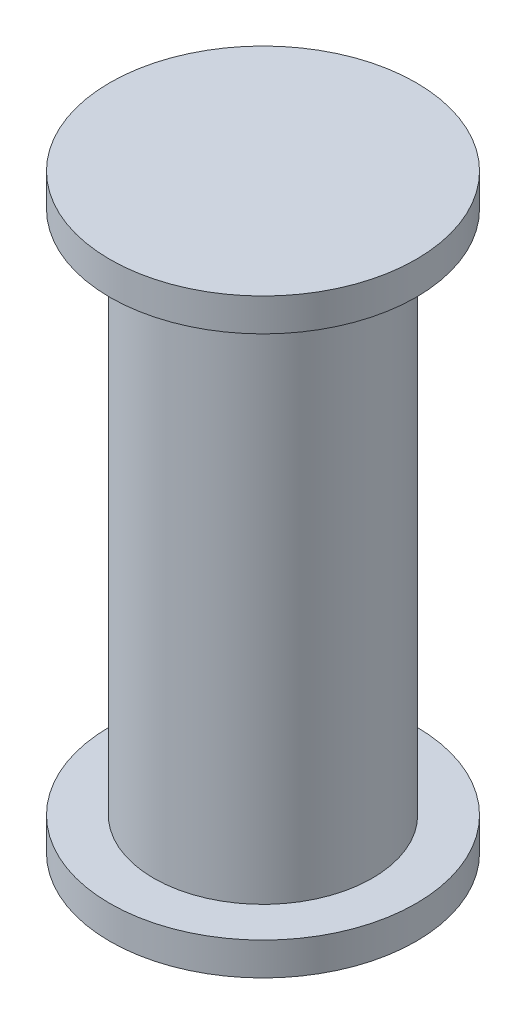
ISO-10303-21;
HEADER;
FILE_DESCRIPTION(('STEP AP214'),'2;1');
FILE_NAME('part.step','',(''),(''),'','','');
FILE_SCHEMA(('AUTOMOTIVE_DESIGN { 1 0 10303 214 1 1 1 1 }'));
ENDSEC;
DATA;
#1=APPLICATION_CONTEXT('core data for automotive mechanical design processes');
#2=APPLICATION_PROTOCOL_DEFINITION('international standard','automotive_design',2000,#1);
#3=PRODUCT_CONTEXT('',#1,'mechanical');
#4=PRODUCT('Part','Part','',(#3));
#5=PRODUCT_RELATED_PRODUCT_CATEGORY('part','',(#4));
#6=PRODUCT_DEFINITION_FORMATION('','',#4);
#7=PRODUCT_DEFINITION_CONTEXT('part definition',#1,'design');
#8=PRODUCT_DEFINITION('design','',#6,#7);
#9=PRODUCT_DEFINITION_SHAPE('','',#8);
#10=(LENGTH_UNIT() NAMED_UNIT(*) SI_UNIT(.MILLI.,.METRE.));
#11=(NAMED_UNIT(*) PLANE_ANGLE_UNIT() SI_UNIT($,.RADIAN.));
#12=(NAMED_UNIT(*) SI_UNIT($,.STERADIAN.) SOLID_ANGLE_UNIT());
#13=UNCERTAINTY_MEASURE_WITH_UNIT(LENGTH_MEASURE(1.E-05),#10,'distance_accuracy_value','');
#14=(GEOMETRIC_REPRESENTATION_CONTEXT(3) GLOBAL_UNCERTAINTY_ASSIGNED_CONTEXT((#13)) GLOBAL_UNIT_ASSIGNED_CONTEXT((#10,
#11,#12)) REPRESENTATION_CONTEXT('',''));
#15=CARTESIAN_POINT('',(0.,0.,0.));
#16=DIRECTION('',(0.,0.,1.));
#17=DIRECTION('',(1.,0.,0.));
#18=AXIS2_PLACEMENT_3D('',#15,#16,#17);
#19=CARTESIAN_POINT('',(0.,12.,0.));
#20=DIRECTION('',(0.,-1.,0.));
#21=DIRECTION('',(0.,0.,-1.));
#22=AXIS2_PLACEMENT_3D('',#19,#20,#21);
#23=CYLINDRICAL_SURFACE('',#22,5.);
#24=CARTESIAN_POINT('',(0.,12.,0.));
#25=DIRECTION('',(0.,1.,0.));
#26=DIRECTION('',(0.,0.,1.));
#27=AXIS2_PLACEMENT_3D('',#24,#25,#26);
#28=CIRCLE('',#27,5.);
#29=CARTESIAN_POINT('',(0.,12.,5.));
#30=VERTEX_POINT('',#29);
#31=EDGE_CURVE('E10',#30,#30,#28,.T.);
#32=ORIENTED_EDGE('',*,*,#31,.F.);
#33=EDGE_LOOP('',(#32));
#34=FACE_BOUND('',#33,.T.);
#35=CARTESIAN_POINT('',(0.,-12.,0.));
#36=DIRECTION('',(0.,1.,0.));
#37=DIRECTION('',(0.,0.,1.));
#38=AXIS2_PLACEMENT_3D('',#35,#36,#37);
#39=CIRCLE('',#38,5.);
#40=CARTESIAN_POINT('',(0.,-12.,5.));
#41=VERTEX_POINT('',#40);
#42=EDGE_CURVE('E46',#41,#41,#39,.T.);
#43=ORIENTED_EDGE('',*,*,#42,.T.);
#44=EDGE_LOOP('',(#43));
#45=FACE_BOUND('',#44,.T.);
#46=ADVANCED_FACE('F43',(#34,#45),#23,.T.);
#47=CARTESIAN_POINT('',(0.,13.5,0.));
#48=DIRECTION('',(0.,-1.,0.));
#49=DIRECTION('',(0.,0.,-1.));
#50=AXIS2_PLACEMENT_3D('',#47,#48,#49);
#51=CYLINDRICAL_SURFACE('',#50,7.);
#52=CARTESIAN_POINT('',(0.,13.5,0.));
#53=DIRECTION('',(0.,1.,0.));
#54=DIRECTION('',(0.,0.,1.));
#55=AXIS2_PLACEMENT_3D('',#52,#53,#54);
#56=CIRCLE('',#55,7.);
#57=CARTESIAN_POINT('',(0.,13.5,7.));
#58=VERTEX_POINT('',#57);
#59=EDGE_CURVE('E51',#58,#58,#56,.T.);
#60=ORIENTED_EDGE('',*,*,#59,.F.);
#61=EDGE_LOOP('',(#60));
#62=FACE_BOUND('',#61,.T.);
#63=CARTESIAN_POINT('',(0.,12.,0.));
#64=DIRECTION('',(0.,1.,0.));
#65=DIRECTION('',(0.,0.,1.));
#66=AXIS2_PLACEMENT_3D('',#63,#64,#65);
#67=CIRCLE('',#66,7.);
#68=CARTESIAN_POINT('',(0.,12.,7.));
#69=VERTEX_POINT('',#68);
#70=EDGE_CURVE('E56',#69,#69,#67,.T.);
#71=ORIENTED_EDGE('',*,*,#70,.T.);
#72=EDGE_LOOP('',(#71));
#73=FACE_BOUND('',#72,.T.);
#74=ADVANCED_FACE('F97',(#62,#73),#51,.T.);
#75=CARTESIAN_POINT('',(0.,13.5,0.));
#76=DIRECTION('',(0.,1.,0.));
#77=DIRECTION('',(0.,0.,1.));
#78=AXIS2_PLACEMENT_3D('',#75,#76,#77);
#79=PLANE('',#78);
#80=ORIENTED_EDGE('',*,*,#59,.T.);
#81=EDGE_LOOP('',(#80));
#82=FACE_BOUND('',#81,.T.);
#83=ADVANCED_FACE('F93',(#82),#79,.T.);
#84=CARTESIAN_POINT('',(0.,12.,0.));
#85=DIRECTION('',(0.,1.,0.));
#86=DIRECTION('',(0.,0.,1.));
#87=AXIS2_PLACEMENT_3D('',#84,#85,#86);
#88=PLANE('',#87);
#89=ORIENTED_EDGE('',*,*,#31,.T.);
#90=EDGE_LOOP('',(#89));
#91=FACE_BOUND('',#90,.T.);
#92=ORIENTED_EDGE('',*,*,#70,.F.);
#93=EDGE_LOOP('',(#92));
#94=FACE_BOUND('',#93,.T.);
#95=ADVANCED_FACE('F85',(#91,#94),#88,.F.);
#96=CARTESIAN_POINT('',(0.,-13.5,0.));
#97=DIRECTION('',(0.,1.,0.));
#98=DIRECTION('',(0.,0.,1.));
#99=AXIS2_PLACEMENT_3D('',#96,#97,#98);
#100=CYLINDRICAL_SURFACE('',#99,7.);
#101=CARTESIAN_POINT('',(0.,-13.5,0.));
#102=DIRECTION('',(0.,1.,0.));
#103=DIRECTION('',(0.,0.,1.));
#104=AXIS2_PLACEMENT_3D('',#101,#102,#103);
#105=CIRCLE('',#104,7.);
#106=CARTESIAN_POINT('',(0.,-13.5,7.));
#107=VERTEX_POINT('',#106);
#108=EDGE_CURVE('E66',#107,#107,#105,.T.);
#109=ORIENTED_EDGE('',*,*,#108,.T.);
#110=EDGE_LOOP('',(#109));
#111=FACE_BOUND('',#110,.T.);
#112=CARTESIAN_POINT('',(0.,-12.,0.));
#113=DIRECTION('',(0.,1.,0.));
#114=DIRECTION('',(0.,0.,1.));
#115=AXIS2_PLACEMENT_3D('',#112,#113,#114);
#116=CIRCLE('',#115,7.);
#117=CARTESIAN_POINT('',(0.,-12.,7.));
#118=VERTEX_POINT('',#117);
#119=EDGE_CURVE('E62',#118,#118,#116,.T.);
#120=ORIENTED_EDGE('',*,*,#119,.F.);
#121=EDGE_LOOP('',(#120));
#122=FACE_BOUND('',#121,.T.);
#123=ADVANCED_FACE('F83',(#111,#122),#100,.T.);
#124=CARTESIAN_POINT('',(0.,-13.5,0.));
#125=DIRECTION('',(0.,-1.,0.));
#126=DIRECTION('',(0.,0.,1.));
#127=AXIS2_PLACEMENT_3D('',#124,#125,#126);
#128=PLANE('',#127);
#129=ORIENTED_EDGE('',*,*,#108,.F.);
#130=EDGE_LOOP('',(#129));
#131=FACE_BOUND('',#130,.T.);
#132=ADVANCED_FACE('F79',(#131),#128,.T.);
#133=CARTESIAN_POINT('',(0.,-12.,0.));
#134=DIRECTION('',(0.,-1.,0.));
#135=DIRECTION('',(0.,0.,1.));
#136=AXIS2_PLACEMENT_3D('',#133,#134,#135);
#137=PLANE('',#136);
#138=ORIENTED_EDGE('',*,*,#42,.F.);
#139=EDGE_LOOP('',(#138));
#140=FACE_BOUND('',#139,.T.);
#141=ORIENTED_EDGE('',*,*,#119,.T.);
#142=EDGE_LOOP('',(#141));
#143=FACE_BOUND('',#142,.T.);
#144=ADVANCED_FACE('F76',(#140,#143),#137,.F.);
#145=CLOSED_SHELL('',(#46,#74,#83,#95,#123,#132,#144));
#146=MANIFOLD_SOLID_BREP('B2',#145);
#147=ADVANCED_BREP_SHAPE_REPRESENTATION('',(#18,#146),#14);
#148=SHAPE_DEFINITION_REPRESENTATION(#9,#147);
ENDSEC;
END-ISO-10303-21;
